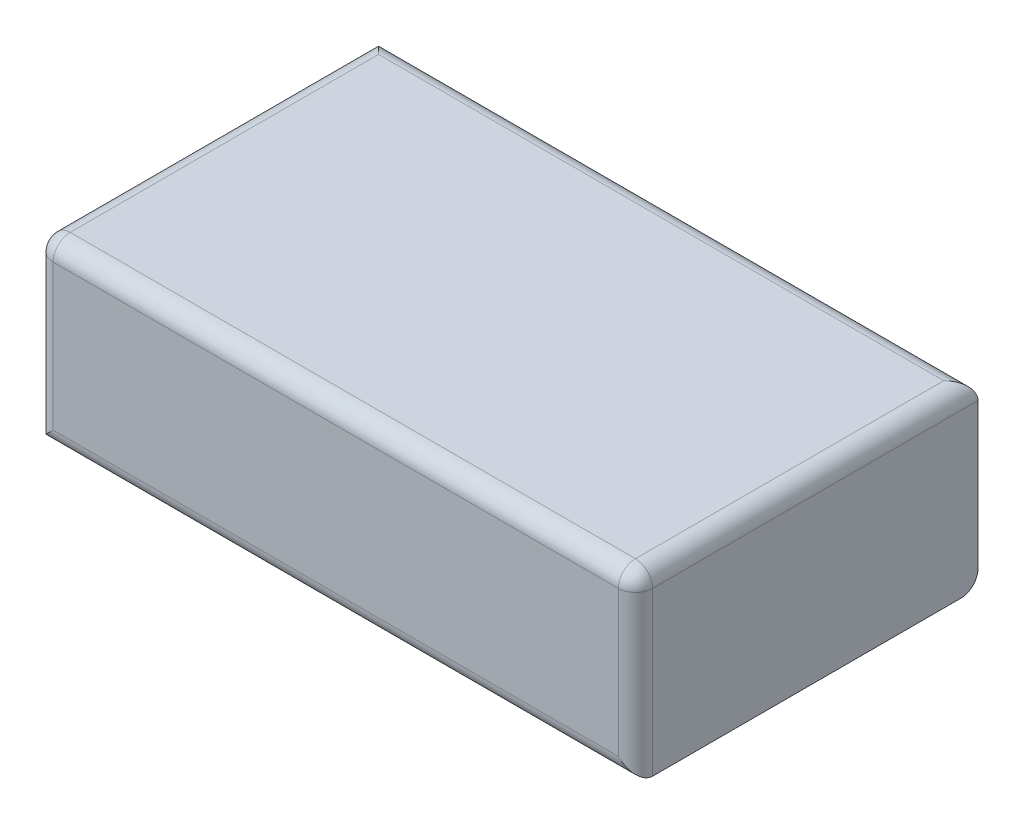
ISO-10303-21;
HEADER;
FILE_DESCRIPTION(('STEP AP214'),'2;1');
FILE_NAME('part.step','',(''),(''),'','','');
FILE_SCHEMA(('AUTOMOTIVE_DESIGN { 1 0 10303 214 1 1 1 1 }'));
ENDSEC;
DATA;
#1=APPLICATION_CONTEXT('core data for automotive mechanical design processes');
#2=APPLICATION_PROTOCOL_DEFINITION('international standard','automotive_design',2000,#1);
#3=PRODUCT_CONTEXT('',#1,'mechanical');
#4=PRODUCT('Part','Part','',(#3));
#5=PRODUCT_RELATED_PRODUCT_CATEGORY('part','',(#4));
#6=PRODUCT_DEFINITION_FORMATION('','',#4);
#7=PRODUCT_DEFINITION_CONTEXT('part definition',#1,'design');
#8=PRODUCT_DEFINITION('design','',#6,#7);
#9=PRODUCT_DEFINITION_SHAPE('','',#8);
#10=(LENGTH_UNIT() NAMED_UNIT(*) SI_UNIT(.MILLI.,.METRE.));
#11=(NAMED_UNIT(*) PLANE_ANGLE_UNIT() SI_UNIT($,.RADIAN.));
#12=(NAMED_UNIT(*) SI_UNIT($,.STERADIAN.) SOLID_ANGLE_UNIT());
#13=UNCERTAINTY_MEASURE_WITH_UNIT(LENGTH_MEASURE(1.E-05),#10,'distance_accuracy_value','');
#14=(GEOMETRIC_REPRESENTATION_CONTEXT(3) GLOBAL_UNCERTAINTY_ASSIGNED_CONTEXT((#13)) GLOBAL_UNIT_ASSIGNED_CONTEXT((#10,
#11,#12)) REPRESENTATION_CONTEXT('',''));
#15=CARTESIAN_POINT('',(0.,0.,0.));
#16=DIRECTION('',(0.,0.,1.));
#17=DIRECTION('',(1.,0.,0.));
#18=AXIS2_PLACEMENT_3D('',#15,#16,#17);
#19=CARTESIAN_POINT('',(17.5,10.5,-10.));
#20=DIRECTION('',(0.,0.,1.));
#21=DIRECTION('',(1.,0.,0.));
#22=AXIS2_PLACEMENT_3D('',#19,#20,#21);
#23=PLANE('',#22);
#24=DIRECTION('',(0.,-1.,0.));
#25=VECTOR('',#24,1.);
#26=CARTESIAN_POINT('',(-17.5,10.5,-10.));
#27=LINE('',#26,#25);
#28=CARTESIAN_POINT('',(-17.5,9.5,-10.));
#29=VERTEX_POINT('',#28);
#30=CARTESIAN_POINT('',(-17.5,1.,-10.));
#31=VERTEX_POINT('',#30);
#32=EDGE_CURVE('E141',#29,#31,#27,.T.);
#33=ORIENTED_EDGE('',*,*,#32,.F.);
#34=DIRECTION('',(-1.,0.,0.));
#35=VECTOR('',#34,1.);
#36=CARTESIAN_POINT('',(17.5,9.5,-10.));
#37=LINE('',#36,#35);
#38=CARTESIAN_POINT('',(17.5,9.5,-10.));
#39=VERTEX_POINT('',#38);
#40=EDGE_CURVE('E165',#29,#39,#37,.F.);
#41=ORIENTED_EDGE('',*,*,#40,.T.);
#42=DIRECTION('',(0.,-1.,0.));
#43=VECTOR('',#42,1.);
#44=CARTESIAN_POINT('',(17.5,10.5,-10.));
#45=LINE('',#44,#43);
#46=CARTESIAN_POINT('',(17.5,1.,-10.));
#47=VERTEX_POINT('',#46);
#48=EDGE_CURVE('E144',#39,#47,#45,.T.);
#49=ORIENTED_EDGE('',*,*,#48,.T.);
#50=DIRECTION('',(-1.,0.,0.));
#51=VECTOR('',#50,1.);
#52=CARTESIAN_POINT('',(17.5,0.999999999999999,-10.));
#53=LINE('',#52,#51);
#54=EDGE_CURVE('E162',#47,#31,#53,.T.);
#55=ORIENTED_EDGE('',*,*,#54,.T.);
#56=EDGE_LOOP('',(#33,#41,#49,#55));
#57=FACE_BOUND('',#56,.T.);
#58=ADVANCED_FACE('F35',(#57),#23,.F.);
#59=CARTESIAN_POINT('',(-17.5,10.5,-10.));
#60=DIRECTION('',(1.,0.,0.));
#61=DIRECTION('',(0.,0.,-1.));
#62=AXIS2_PLACEMENT_3D('',#59,#60,#61);
#63=PLANE('',#62);
#64=DIRECTION('',(0.,-1.,0.));
#65=VECTOR('',#64,1.);
#66=CARTESIAN_POINT('',(-17.5,10.5,9.));
#67=LINE('',#66,#65);
#68=CARTESIAN_POINT('',(-17.5,0.,9.));
#69=VERTEX_POINT('',#68);
#70=CARTESIAN_POINT('',(-17.5,9.5,9.));
#71=VERTEX_POINT('',#70);
#72=EDGE_CURVE('E159',#69,#71,#67,.F.);
#73=ORIENTED_EDGE('',*,*,#72,.T.);
#74=DIRECTION('',(0.,0.,1.));
#75=VECTOR('',#74,1.);
#76=CARTESIAN_POINT('',(-17.5,9.5,-10.));
#77=LINE('',#76,#75);
#78=EDGE_CURVE('E124',#71,#29,#77,.F.);
#79=ORIENTED_EDGE('',*,*,#78,.T.);
#80=ORIENTED_EDGE('',*,*,#32,.T.);
#81=CARTESIAN_POINT('',(-17.5,0.999999999999999,-9.));
#82=DIRECTION('',(1.,0.,0.));
#83=DIRECTION('',(0.,0.,-1.));
#84=AXIS2_PLACEMENT_3D('',#81,#82,#83);
#85=CIRCLE('',#84,1.);
#86=CARTESIAN_POINT('',(-17.5,0.,-9.));
#87=VERTEX_POINT('',#86);
#88=EDGE_CURVE('E157',#31,#87,#85,.F.);
#89=ORIENTED_EDGE('',*,*,#88,.T.);
#90=DIRECTION('',(0.,0.,1.));
#91=VECTOR('',#90,1.);
#92=CARTESIAN_POINT('',(-17.5,0.,-10.));
#93=LINE('',#92,#91);
#94=EDGE_CURVE('E185',#87,#69,#93,.T.);
#95=ORIENTED_EDGE('',*,*,#94,.T.);
#96=EDGE_LOOP('',(#73,#79,#80,#89,#95));
#97=FACE_BOUND('',#96,.T.);
#98=ADVANCED_FACE('F208',(#97),#63,.F.);
#99=CARTESIAN_POINT('',(-17.5,10.5,10.));
#100=DIRECTION('',(0.,0.,-1.));
#101=DIRECTION('',(-1.,0.,0.));
#102=AXIS2_PLACEMENT_3D('',#99,#100,#101);
#103=PLANE('',#102);
#104=DIRECTION('',(1.,0.,0.));
#105=VECTOR('',#104,1.);
#106=CARTESIAN_POINT('',(-17.5,9.5,10.));
#107=LINE('',#106,#105);
#108=CARTESIAN_POINT('',(16.5,9.5,10.));
#109=VERTEX_POINT('',#108);
#110=CARTESIAN_POINT('',(-16.5,9.5,10.));
#111=VERTEX_POINT('',#110);
#112=EDGE_CURVE('E52',#109,#111,#107,.F.);
#113=ORIENTED_EDGE('',*,*,#112,.T.);
#114=DIRECTION('',(0.,-1.,0.));
#115=VECTOR('',#114,1.);
#116=CARTESIAN_POINT('',(-16.5,10.5,10.));
#117=LINE('',#116,#115);
#118=CARTESIAN_POINT('',(-16.5,0.999999999999999,10.));
#119=VERTEX_POINT('',#118);
#120=EDGE_CURVE('E171',#111,#119,#117,.T.);
#121=ORIENTED_EDGE('',*,*,#120,.T.);
#122=DIRECTION('',(1.,0.,0.));
#123=VECTOR('',#122,1.);
#124=CARTESIAN_POINT('',(-17.5,0.999999999999999,10.));
#125=LINE('',#124,#123);
#126=CARTESIAN_POINT('',(16.5,0.999999999999999,10.));
#127=VERTEX_POINT('',#126);
#128=EDGE_CURVE('E167',#119,#127,#125,.T.);
#129=ORIENTED_EDGE('',*,*,#128,.T.);
#130=DIRECTION('',(0.,-1.,0.));
#131=VECTOR('',#130,1.);
#132=CARTESIAN_POINT('',(16.5,10.5,10.));
#133=LINE('',#132,#131);
#134=EDGE_CURVE('E57',#127,#109,#133,.F.);
#135=ORIENTED_EDGE('',*,*,#134,.T.);
#136=EDGE_LOOP('',(#113,#121,#129,#135));
#137=FACE_BOUND('',#136,.T.);
#138=ADVANCED_FACE('F239',(#137),#103,.F.);
#139=CARTESIAN_POINT('',(17.5,10.5,10.));
#140=DIRECTION('',(-1.,0.,0.));
#141=DIRECTION('',(0.,0.,1.));
#142=AXIS2_PLACEMENT_3D('',#139,#140,#141);
#143=PLANE('',#142);
#144=ORIENTED_EDGE('',*,*,#48,.F.);
#145=DIRECTION('',(0.,0.,-1.));
#146=VECTOR('',#145,1.);
#147=CARTESIAN_POINT('',(17.5,9.5,10.));
#148=LINE('',#147,#146);
#149=CARTESIAN_POINT('',(17.5,9.5,9.));
#150=VERTEX_POINT('',#149);
#151=EDGE_CURVE('E154',#39,#150,#148,.F.);
#152=ORIENTED_EDGE('',*,*,#151,.T.);
#153=DIRECTION('',(0.,-1.,0.));
#154=VECTOR('',#153,1.);
#155=CARTESIAN_POINT('',(17.5,10.5,9.));
#156=LINE('',#155,#154);
#157=CARTESIAN_POINT('',(17.5,0.,9.));
#158=VERTEX_POINT('',#157);
#159=EDGE_CURVE('E152',#150,#158,#156,.T.);
#160=ORIENTED_EDGE('',*,*,#159,.T.);
#161=DIRECTION('',(0.,0.,-1.));
#162=VECTOR('',#161,1.);
#163=CARTESIAN_POINT('',(17.5,0.,10.));
#164=LINE('',#163,#162);
#165=CARTESIAN_POINT('',(17.5,0.,-9.));
#166=VERTEX_POINT('',#165);
#167=EDGE_CURVE('E190',#158,#166,#164,.T.);
#168=ORIENTED_EDGE('',*,*,#167,.T.);
#169=CARTESIAN_POINT('',(17.5,0.999999999999999,-9.));
#170=DIRECTION('',(-1.,0.,0.));
#171=DIRECTION('',(0.,0.,1.));
#172=AXIS2_PLACEMENT_3D('',#169,#170,#171);
#173=CIRCLE('',#172,1.);
#174=EDGE_CURVE('E150',#166,#47,#173,.F.);
#175=ORIENTED_EDGE('',*,*,#174,.T.);
#176=EDGE_LOOP('',(#144,#152,#160,#168,#175));
#177=FACE_BOUND('',#176,.T.);
#178=ADVANCED_FACE('F244',(#177),#143,.F.);
#179=CARTESIAN_POINT('',(0.,10.5,0.));
#180=DIRECTION('',(0.,1.,0.));
#181=DIRECTION('',(0.,0.,1.));
#182=AXIS2_PLACEMENT_3D('',#179,#180,#181);
#183=PLANE('',#182);
#184=DIRECTION('',(0.,0.,-1.));
#185=VECTOR('',#184,1.);
#186=CARTESIAN_POINT('',(16.5,10.5,-10.));
#187=LINE('',#186,#185);
#188=CARTESIAN_POINT('',(16.5,10.5,9.));
#189=VERTEX_POINT('',#188);
#190=CARTESIAN_POINT('',(16.5,10.5,-9.));
#191=VERTEX_POINT('',#190);
#192=EDGE_CURVE('E117',#189,#191,#187,.T.);
#193=ORIENTED_EDGE('',*,*,#192,.T.);
#194=DIRECTION('',(-1.,0.,0.));
#195=VECTOR('',#194,1.);
#196=CARTESIAN_POINT('',(-17.5,10.5,-9.));
#197=LINE('',#196,#195);
#198=CARTESIAN_POINT('',(-16.5,10.5,-9.));
#199=VERTEX_POINT('',#198);
#200=EDGE_CURVE('E113',#191,#199,#197,.T.);
#201=ORIENTED_EDGE('',*,*,#200,.T.);
#202=DIRECTION('',(0.,0.,1.));
#203=VECTOR('',#202,1.);
#204=CARTESIAN_POINT('',(-16.5,10.5,10.));
#205=LINE('',#204,#203);
#206=CARTESIAN_POINT('',(-16.5,10.5,9.));
#207=VERTEX_POINT('',#206);
#208=EDGE_CURVE('E105',#199,#207,#205,.T.);
#209=ORIENTED_EDGE('',*,*,#208,.T.);
#210=DIRECTION('',(1.,0.,0.));
#211=VECTOR('',#210,1.);
#212=CARTESIAN_POINT('',(17.5,10.5,9.));
#213=LINE('',#212,#211);
#214=EDGE_CURVE('E110',#207,#189,#213,.T.);
#215=ORIENTED_EDGE('',*,*,#214,.T.);
#216=EDGE_LOOP('',(#193,#201,#209,#215));
#217=FACE_BOUND('',#216,.T.);
#218=ADVANCED_FACE('F108',(#217),#183,.T.);
#219=CARTESIAN_POINT('',(0.,0.,0.));
#220=DIRECTION('',(0.,1.,0.));
#221=DIRECTION('',(0.,0.,1.));
#222=AXIS2_PLACEMENT_3D('',#219,#220,#221);
#223=PLANE('',#222);
#224=ORIENTED_EDGE('',*,*,#167,.F.);
#225=DIRECTION('',(1.,0.,0.));
#226=VECTOR('',#225,1.);
#227=CARTESIAN_POINT('',(0.,0.,9.));
#228=LINE('',#227,#226);
#229=EDGE_CURVE('E11',#158,#69,#228,.F.);
#230=ORIENTED_EDGE('',*,*,#229,.T.);
#231=ORIENTED_EDGE('',*,*,#94,.F.);
#232=DIRECTION('',(-1.,0.,0.));
#233=VECTOR('',#232,1.);
#234=CARTESIAN_POINT('',(0.,0.,-9.));
#235=LINE('',#234,#233);
#236=EDGE_CURVE('E44',#87,#166,#235,.F.);
#237=ORIENTED_EDGE('',*,*,#236,.T.);
#238=EDGE_LOOP('',(#224,#230,#231,#237));
#239=FACE_BOUND('',#238,.T.);
#240=ADVANCED_FACE('F211',(#239),#223,.F.);
#241=CARTESIAN_POINT('',(-16.5,10.5,9.));
#242=DIRECTION('',(0.,-1.,0.));
#243=DIRECTION('',(0.,0.,-1.));
#244=AXIS2_PLACEMENT_3D('',#241,#242,#243);
#245=CYLINDRICAL_SURFACE('',#244,1.);
#246=CARTESIAN_POINT('',(-16.5,9.5,9.));
#247=DIRECTION('',(0.,1.,0.));
#248=DIRECTION('',(0.,0.,1.));
#249=AXIS2_PLACEMENT_3D('',#246,#247,#248);
#250=CIRCLE('',#249,1.);
#251=EDGE_CURVE('E133',#71,#111,#250,.T.);
#252=ORIENTED_EDGE('',*,*,#251,.F.);
#253=ORIENTED_EDGE('',*,*,#72,.F.);
#254=CARTESIAN_POINT('',(-16.5,0.999999999999999,9.));
#255=DIRECTION('',(0.707106781186547,-0.707106781186547,0.));
#256=DIRECTION('',(0.707106781186547,0.707106781186547,0.));
#257=AXIS2_PLACEMENT_3D('',#254,#255,#256);
#258=ELLIPSE('',#257,1.41421356237309,1.);
#259=EDGE_CURVE('E39',#119,#69,#258,.T.);
#260=ORIENTED_EDGE('',*,*,#259,.F.);
#261=ORIENTED_EDGE('',*,*,#120,.F.);
#262=EDGE_LOOP('',(#252,#253,#260,#261));
#263=FACE_BOUND('',#262,.T.);
#264=ADVANCED_FACE('F249',(#263),#245,.T.);
#265=CARTESIAN_POINT('',(-17.5,0.999999999999999,9.));
#266=DIRECTION('',(1.,0.,0.));
#267=DIRECTION('',(0.,0.,-1.));
#268=AXIS2_PLACEMENT_3D('',#265,#266,#267);
#269=CYLINDRICAL_SURFACE('',#268,1.);
#270=ORIENTED_EDGE('',*,*,#259,.T.);
#271=ORIENTED_EDGE('',*,*,#229,.F.);
#272=CARTESIAN_POINT('',(16.5,0.999999999999999,9.));
#273=DIRECTION('',(0.707106781186547,0.707106781186547,0.));
#274=DIRECTION('',(0.707106781186547,-0.707106781186547,0.));
#275=AXIS2_PLACEMENT_3D('',#272,#273,#274);
#276=ELLIPSE('',#275,1.41421356237309,1.);
#277=EDGE_CURVE('E135',#127,#158,#276,.T.);
#278=ORIENTED_EDGE('',*,*,#277,.F.);
#279=ORIENTED_EDGE('',*,*,#128,.F.);
#280=EDGE_LOOP('',(#270,#271,#278,#279));
#281=FACE_BOUND('',#280,.T.);
#282=ADVANCED_FACE('F213',(#281),#269,.T.);
#283=CARTESIAN_POINT('',(-16.5,9.5,9.));
#284=DIRECTION('',(0.,0.,1.));
#285=DIRECTION('',(1.,0.,0.));
#286=AXIS2_PLACEMENT_3D('',#283,#284,#285);
#287=SPHERICAL_SURFACE('',#286,1.);
#288=CARTESIAN_POINT('',(-16.5,9.5,9.));
#289=DIRECTION('',(0.,0.,1.));
#290=DIRECTION('',(1.,0.,0.));
#291=AXIS2_PLACEMENT_3D('',#288,#289,#290);
#292=CIRCLE('',#291,1.);
#293=EDGE_CURVE('E121',#71,#207,#292,.F.);
#294=ORIENTED_EDGE('',*,*,#293,.F.);
#295=ORIENTED_EDGE('',*,*,#251,.T.);
#296=CARTESIAN_POINT('',(-16.5,9.5,9.));
#297=DIRECTION('',(-1.,0.,0.));
#298=DIRECTION('',(0.,-1.,0.));
#299=AXIS2_PLACEMENT_3D('',#296,#297,#298);
#300=CIRCLE('',#299,1.);
#301=EDGE_CURVE('E127',#207,#111,#300,.F.);
#302=ORIENTED_EDGE('',*,*,#301,.F.);
#303=EDGE_LOOP('',(#294,#295,#302));
#304=FACE_BOUND('',#303,.T.);
#305=ADVANCED_FACE('F131',(#304),#287,.T.);
#306=CARTESIAN_POINT('',(16.5,10.5,9.));
#307=DIRECTION('',(0.,-1.,0.));
#308=DIRECTION('',(0.,0.,-1.));
#309=AXIS2_PLACEMENT_3D('',#306,#307,#308);
#310=CYLINDRICAL_SURFACE('',#309,1.);
#311=ORIENTED_EDGE('',*,*,#277,.T.);
#312=ORIENTED_EDGE('',*,*,#159,.F.);
#313=CARTESIAN_POINT('',(16.5,9.5,9.));
#314=DIRECTION('',(0.,1.,0.));
#315=DIRECTION('',(0.,0.,1.));
#316=AXIS2_PLACEMENT_3D('',#313,#314,#315);
#317=CIRCLE('',#316,1.);
#318=EDGE_CURVE('E128',#109,#150,#317,.T.);
#319=ORIENTED_EDGE('',*,*,#318,.F.);
#320=ORIENTED_EDGE('',*,*,#134,.F.);
#321=EDGE_LOOP('',(#311,#312,#319,#320));
#322=FACE_BOUND('',#321,.T.);
#323=ADVANCED_FACE('F216',(#322),#310,.T.);
#324=CARTESIAN_POINT('',(0.,9.5,9.));
#325=DIRECTION('',(-1.,0.,0.));
#326=DIRECTION('',(0.,0.,1.));
#327=AXIS2_PLACEMENT_3D('',#324,#325,#326);
#328=CYLINDRICAL_SURFACE('',#327,1.);
#329=ORIENTED_EDGE('',*,*,#301,.T.);
#330=ORIENTED_EDGE('',*,*,#112,.F.);
#331=CARTESIAN_POINT('',(16.5,9.5,9.));
#332=DIRECTION('',(1.,0.,0.));
#333=DIRECTION('',(0.,0.,-1.));
#334=AXIS2_PLACEMENT_3D('',#331,#332,#333);
#335=CIRCLE('',#334,1.);
#336=EDGE_CURVE('E139',#189,#109,#335,.T.);
#337=ORIENTED_EDGE('',*,*,#336,.F.);
#338=ORIENTED_EDGE('',*,*,#214,.F.);
#339=EDGE_LOOP('',(#329,#330,#337,#338));
#340=FACE_BOUND('',#339,.T.);
#341=ADVANCED_FACE('F137',(#340),#328,.T.);
#342=CARTESIAN_POINT('',(-16.5,9.5,0.));
#343=DIRECTION('',(0.,0.,-1.));
#344=DIRECTION('',(-1.,0.,0.));
#345=AXIS2_PLACEMENT_3D('',#342,#343,#344);
#346=CYLINDRICAL_SURFACE('',#345,1.);
#347=ORIENTED_EDGE('',*,*,#293,.T.);
#348=ORIENTED_EDGE('',*,*,#208,.F.);
#349=CARTESIAN_POINT('',(-16.5,9.5,-9.));
#350=DIRECTION('',(0.707106781186547,0.,-0.707106781186548));
#351=DIRECTION('',(0.707106781186548,0.,0.707106781186547));
#352=AXIS2_PLACEMENT_3D('',#349,#350,#351);
#353=ELLIPSE('',#352,1.4142135623731,1.);
#354=EDGE_CURVE('E178',#29,#199,#353,.T.);
#355=ORIENTED_EDGE('',*,*,#354,.F.);
#356=ORIENTED_EDGE('',*,*,#78,.F.);
#357=EDGE_LOOP('',(#347,#348,#355,#356));
#358=FACE_BOUND('',#357,.T.);
#359=ADVANCED_FACE('F123',(#358),#346,.T.);
#360=CARTESIAN_POINT('',(16.5,9.5,9.));
#361=DIRECTION('',(0.,0.,1.));
#362=DIRECTION('',(1.,0.,0.));
#363=AXIS2_PLACEMENT_3D('',#360,#361,#362);
#364=SPHERICAL_SURFACE('',#363,1.);
#365=ORIENTED_EDGE('',*,*,#336,.T.);
#366=ORIENTED_EDGE('',*,*,#318,.T.);
#367=CARTESIAN_POINT('',(16.5,9.5,9.));
#368=DIRECTION('',(0.,0.,1.));
#369=DIRECTION('',(1.,0.,0.));
#370=AXIS2_PLACEMENT_3D('',#367,#368,#369);
#371=CIRCLE('',#370,1.);
#372=EDGE_CURVE('E176',#189,#150,#371,.F.);
#373=ORIENTED_EDGE('',*,*,#372,.F.);
#374=EDGE_LOOP('',(#365,#366,#373));
#375=FACE_BOUND('',#374,.T.);
#376=ADVANCED_FACE('F219',(#375),#364,.T.);
#377=CARTESIAN_POINT('',(0.,9.5,-9.));
#378=DIRECTION('',(1.,0.,0.));
#379=DIRECTION('',(0.,0.,-1.));
#380=AXIS2_PLACEMENT_3D('',#377,#378,#379);
#381=CYLINDRICAL_SURFACE('',#380,1.);
#382=ORIENTED_EDGE('',*,*,#354,.T.);
#383=ORIENTED_EDGE('',*,*,#200,.F.);
#384=CARTESIAN_POINT('',(16.5,9.5,-9.));
#385=DIRECTION('',(0.707106781186548,0.,0.707106781186547));
#386=DIRECTION('',(0.707106781186547,0.,-0.707106781186547));
#387=AXIS2_PLACEMENT_3D('',#384,#385,#386);
#388=ELLIPSE('',#387,1.4142135623731,1.);
#389=EDGE_CURVE('E174',#39,#191,#388,.T.);
#390=ORIENTED_EDGE('',*,*,#389,.F.);
#391=ORIENTED_EDGE('',*,*,#40,.F.);
#392=EDGE_LOOP('',(#382,#383,#390,#391));
#393=FACE_BOUND('',#392,.T.);
#394=ADVANCED_FACE('F225',(#393),#381,.T.);
#395=CARTESIAN_POINT('',(16.5,9.5,0.));
#396=DIRECTION('',(0.,0.,1.));
#397=DIRECTION('',(1.,0.,0.));
#398=AXIS2_PLACEMENT_3D('',#395,#396,#397);
#399=CYLINDRICAL_SURFACE('',#398,1.);
#400=ORIENTED_EDGE('',*,*,#372,.T.);
#401=ORIENTED_EDGE('',*,*,#151,.F.);
#402=ORIENTED_EDGE('',*,*,#389,.T.);
#403=ORIENTED_EDGE('',*,*,#192,.F.);
#404=EDGE_LOOP('',(#400,#401,#402,#403));
#405=FACE_BOUND('',#404,.T.);
#406=ADVANCED_FACE('F222',(#405),#399,.T.);
#407=CARTESIAN_POINT('',(17.5,0.999999999999999,-9.));
#408=DIRECTION('',(-1.,0.,0.));
#409=DIRECTION('',(0.,0.,1.));
#410=AXIS2_PLACEMENT_3D('',#407,#408,#409);
#411=CYLINDRICAL_SURFACE('',#410,1.);
#412=ORIENTED_EDGE('',*,*,#174,.F.);
#413=ORIENTED_EDGE('',*,*,#236,.F.);
#414=ORIENTED_EDGE('',*,*,#88,.F.);
#415=ORIENTED_EDGE('',*,*,#54,.F.);
#416=EDGE_LOOP('',(#412,#413,#414,#415));
#417=FACE_BOUND('',#416,.T.);
#418=ADVANCED_FACE('F37',(#417),#411,.T.);
#419=CLOSED_SHELL('',(#58,#98,#138,#178,#218,#240,#264,#282,#305,#323,#341,#359,#376,#394,#406,#418));
#420=MANIFOLD_SOLID_BREP('B2',#419);
#421=ADVANCED_BREP_SHAPE_REPRESENTATION('',(#18,#420),#14);
#422=SHAPE_DEFINITION_REPRESENTATION(#9,#421);
ENDSEC;
END-ISO-10303-21;
